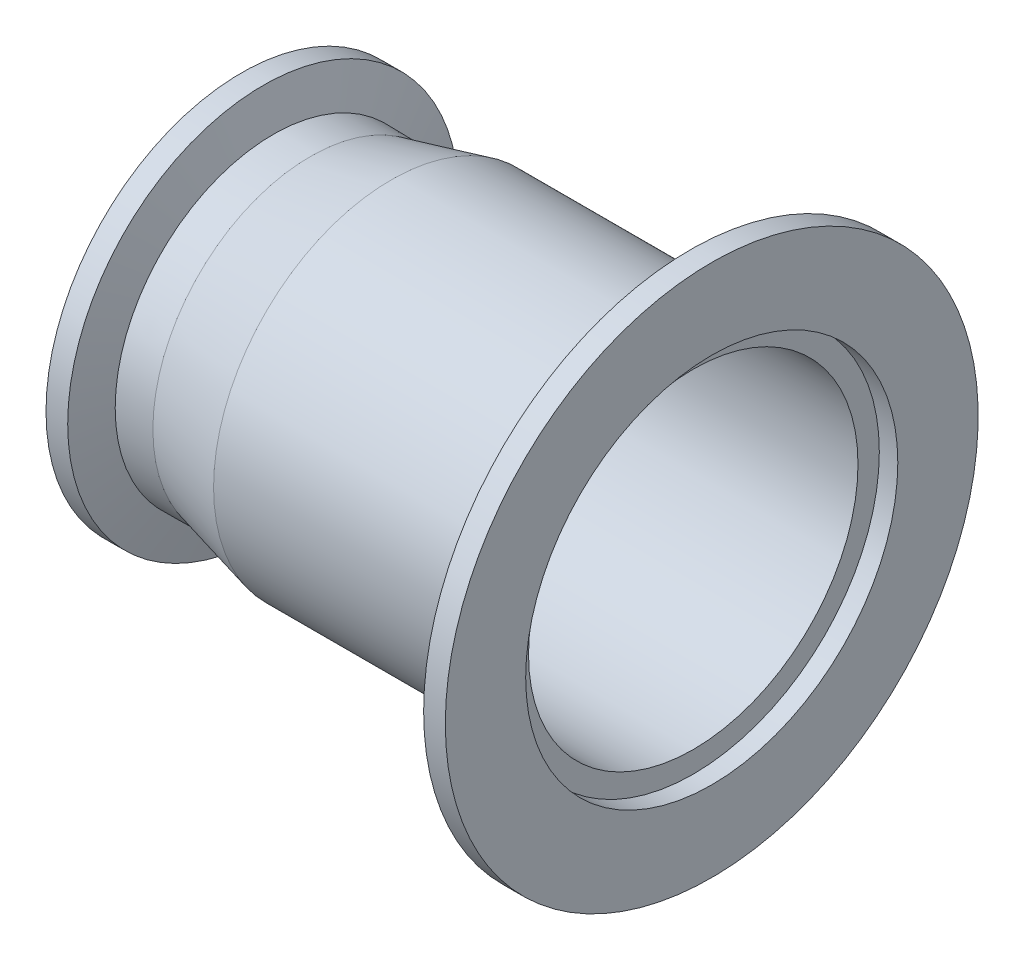
ISO-10303-21;
HEADER;
FILE_DESCRIPTION(('STEP AP214'),'2;1');
FILE_NAME('part.step','',(''),(''),'','','');
FILE_SCHEMA(('AUTOMOTIVE_DESIGN { 1 0 10303 214 1 1 1 1 }'));
ENDSEC;
DATA;
#1=APPLICATION_CONTEXT('core data for automotive mechanical design processes');
#2=APPLICATION_PROTOCOL_DEFINITION('international standard','automotive_design',2000,#1);
#3=PRODUCT_CONTEXT('',#1,'mechanical');
#4=PRODUCT('Part','Part','',(#3));
#5=PRODUCT_RELATED_PRODUCT_CATEGORY('part','',(#4));
#6=PRODUCT_DEFINITION_FORMATION('','',#4);
#7=PRODUCT_DEFINITION_CONTEXT('part definition',#1,'design');
#8=PRODUCT_DEFINITION('design','',#6,#7);
#9=PRODUCT_DEFINITION_SHAPE('','',#8);
#10=(LENGTH_UNIT() NAMED_UNIT(*) SI_UNIT(.MILLI.,.METRE.));
#11=(NAMED_UNIT(*) PLANE_ANGLE_UNIT() SI_UNIT($,.RADIAN.));
#12=(NAMED_UNIT(*) SI_UNIT($,.STERADIAN.) SOLID_ANGLE_UNIT());
#13=UNCERTAINTY_MEASURE_WITH_UNIT(LENGTH_MEASURE(1.E-05),#10,'distance_accuracy_value','');
#14=(GEOMETRIC_REPRESENTATION_CONTEXT(3) GLOBAL_UNCERTAINTY_ASSIGNED_CONTEXT((#13)) GLOBAL_UNIT_ASSIGNED_CONTEXT((#10,
#11,#12)) REPRESENTATION_CONTEXT('',''));
#15=CARTESIAN_POINT('',(0.,0.,0.));
#16=DIRECTION('',(0.,0.,1.));
#17=DIRECTION('',(1.,0.,0.));
#18=AXIS2_PLACEMENT_3D('',#15,#16,#17);
#19=CARTESIAN_POINT('',(66.5851096693486,0.,0.));
#20=DIRECTION('',(1.,0.,0.));
#21=DIRECTION('',(0.,0.,-1.));
#22=AXIS2_PLACEMENT_3D('',#19,#20,#21);
#23=PLANE('',#22);
#24=CARTESIAN_POINT('',(66.5851096693486,0.,14.69801));
#25=DIRECTION('',(-1.,0.,0.));
#26=DIRECTION('',(0.,0.,1.));
#27=AXIS2_PLACEMENT_3D('',#24,#25,#26);
#28=CIRCLE('',#27,23.1649995639334);
#29=CARTESIAN_POINT('',(66.5851096693486,0.,37.8630095639334));
#30=VERTEX_POINT('',#29);
#31=EDGE_CURVE('E84',#30,#30,#28,.T.);
#32=ORIENTED_EDGE('',*,*,#31,.T.);
#33=EDGE_LOOP('',(#32));
#34=FACE_BOUND('',#33,.T.);
#35=CARTESIAN_POINT('',(66.5851096693486,0.,14.69801));
#36=DIRECTION('',(-1.,0.,0.));
#37=DIRECTION('',(0.,0.,1.));
#38=AXIS2_PLACEMENT_3D('',#35,#36,#37);
#39=CIRCLE('',#38,26.1649995639334);
#40=CARTESIAN_POINT('',(66.5851096693486,0.,40.8630095639334));
#41=VERTEX_POINT('',#40);
#42=EDGE_CURVE('E10',#41,#41,#39,.T.);
#43=ORIENTED_EDGE('',*,*,#42,.F.);
#44=EDGE_LOOP('',(#43));
#45=FACE_BOUND('',#44,.T.);
#46=ADVANCED_FACE('F32',(#34,#45),#23,.T.);
#47=CARTESIAN_POINT('',(0.,0.,14.69801));
#48=DIRECTION('',(-1.,0.,0.));
#49=DIRECTION('',(0.,0.,1.));
#50=AXIS2_PLACEMENT_3D('',#47,#48,#49);
#51=CYLINDRICAL_SURFACE('',#50,26.1649995639334);
#52=ORIENTED_EDGE('',*,*,#42,.T.);
#53=EDGE_LOOP('',(#52));
#54=FACE_BOUND('',#53,.T.);
#55=CARTESIAN_POINT('',(69.1851096693486,0.,14.69801));
#56=DIRECTION('',(-1.,0.,0.));
#57=DIRECTION('',(0.,0.,1.));
#58=AXIS2_PLACEMENT_3D('',#55,#56,#57);
#59=CIRCLE('',#58,26.1649995639334);
#60=CARTESIAN_POINT('',(69.1851096693486,0.,40.8630095639334));
#61=VERTEX_POINT('',#60);
#62=EDGE_CURVE('E38',#61,#61,#59,.T.);
#63=ORIENTED_EDGE('',*,*,#62,.F.);
#64=EDGE_LOOP('',(#63));
#65=FACE_BOUND('',#64,.T.);
#66=ADVANCED_FACE('F132',(#54,#65),#51,.F.);
#67=CARTESIAN_POINT('',(69.1851096693485,0.,0.));
#68=DIRECTION('',(1.,0.,0.));
#69=DIRECTION('',(0.,0.,-1.));
#70=AXIS2_PLACEMENT_3D('',#67,#68,#69);
#71=PLANE('',#70);
#72=ORIENTED_EDGE('',*,*,#62,.T.);
#73=EDGE_LOOP('',(#72));
#74=FACE_BOUND('',#73,.T.);
#75=CARTESIAN_POINT('',(69.1851096693485,0.,14.69801));
#76=DIRECTION('',(-1.,0.,0.));
#77=DIRECTION('',(0.,0.,1.));
#78=AXIS2_PLACEMENT_3D('',#75,#76,#77);
#79=CIRCLE('',#78,37.4649995639334);
#80=CARTESIAN_POINT('',(69.1851096693485,0.,52.1630095639334));
#81=VERTEX_POINT('',#80);
#82=EDGE_CURVE('E42',#81,#81,#79,.T.);
#83=ORIENTED_EDGE('',*,*,#82,.F.);
#84=EDGE_LOOP('',(#83));
#85=FACE_BOUND('',#84,.T.);
#86=ADVANCED_FACE('F136',(#74,#85),#71,.T.);
#87=CARTESIAN_POINT('',(0.,0.,14.69801));
#88=DIRECTION('',(-1.,0.,0.));
#89=DIRECTION('',(0.,0.,1.));
#90=AXIS2_PLACEMENT_3D('',#87,#88,#89);
#91=CYLINDRICAL_SURFACE('',#90,37.4649995639334);
#92=ORIENTED_EDGE('',*,*,#82,.T.);
#93=EDGE_LOOP('',(#92));
#94=FACE_BOUND('',#93,.T.);
#95=CARTESIAN_POINT('',(66.1351096716383,0.,14.69801));
#96=DIRECTION('',(-1.,0.,0.));
#97=DIRECTION('',(0.,0.,1.));
#98=AXIS2_PLACEMENT_3D('',#95,#96,#97);
#99=CIRCLE('',#98,37.4649995639334);
#100=CARTESIAN_POINT('',(66.1351096716383,0.,52.1630095639334));
#101=VERTEX_POINT('',#100);
#102=EDGE_CURVE('E46',#101,#101,#99,.T.);
#103=ORIENTED_EDGE('',*,*,#102,.F.);
#104=EDGE_LOOP('',(#103));
#105=FACE_BOUND('',#104,.T.);
#106=ADVANCED_FACE('F140',(#94,#105),#91,.T.);
#107=CARTESIAN_POINT('',(64.1051096716383,0.,14.69801));
#108=DIRECTION('',(1.,0.,0.));
#109=DIRECTION('',(0.,0.,-1.));
#110=AXIS2_PLACEMENT_3D('',#107,#108,#109);
#111=CONICAL_SURFACE('',#110,29.8849995639334,1.30912678720113);
#112=ORIENTED_EDGE('',*,*,#102,.T.);
#113=EDGE_LOOP('',(#112));
#114=FACE_BOUND('',#113,.T.);
#115=CARTESIAN_POINT('',(64.1051096716383,0.,14.69801));
#116=DIRECTION('',(-1.,0.,0.));
#117=DIRECTION('',(0.,0.,1.));
#118=AXIS2_PLACEMENT_3D('',#115,#116,#117);
#119=CIRCLE('',#118,29.8849995639334);
#120=CARTESIAN_POINT('',(64.1051096716383,0.,44.5830095639334));
#121=VERTEX_POINT('',#120);
#122=EDGE_CURVE('E51',#121,#121,#119,.T.);
#123=ORIENTED_EDGE('',*,*,#122,.F.);
#124=EDGE_LOOP('',(#123));
#125=FACE_BOUND('',#124,.T.);
#126=ADVANCED_FACE('F146',(#114,#125),#111,.T.);
#127=CARTESIAN_POINT('',(64.1051096716383,0.,0.));
#128=DIRECTION('',(-1.,0.,0.));
#129=DIRECTION('',(0.,0.,1.));
#130=AXIS2_PLACEMENT_3D('',#127,#128,#129);
#131=PLANE('',#130);
#132=ORIENTED_EDGE('',*,*,#122,.T.);
#133=EDGE_LOOP('',(#132));
#134=FACE_BOUND('',#133,.T.);
#135=CARTESIAN_POINT('',(64.1051096716383,0.,14.69801));
#136=DIRECTION('',(-1.,0.,0.));
#137=DIRECTION('',(0.,0.,1.));
#138=AXIS2_PLACEMENT_3D('',#135,#136,#137);
#139=CIRCLE('',#138,24.9749995639334);
#140=CARTESIAN_POINT('',(64.1051096716383,0.,39.6730095639334));
#141=VERTEX_POINT('',#140);
#142=EDGE_CURVE('E54',#141,#141,#139,.T.);
#143=ORIENTED_EDGE('',*,*,#142,.F.);
#144=EDGE_LOOP('',(#143));
#145=FACE_BOUND('',#144,.T.);
#146=ADVANCED_FACE('F150',(#134,#145),#131,.T.);
#147=CARTESIAN_POINT('',(0.,0.,14.69801));
#148=DIRECTION('',(-1.,0.,0.));
#149=DIRECTION('',(0.,0.,1.));
#150=AXIS2_PLACEMENT_3D('',#147,#148,#149);
#151=CYLINDRICAL_SURFACE('',#150,24.9749995639334);
#152=ORIENTED_EDGE('',*,*,#142,.T.);
#153=EDGE_LOOP('',(#152));
#154=FACE_BOUND('',#153,.T.);
#155=CARTESIAN_POINT('',(24.1051096716383,0.,14.69801));
#156=DIRECTION('',(-1.,0.,0.));
#157=DIRECTION('',(0.,0.,1.));
#158=AXIS2_PLACEMENT_3D('',#155,#156,#157);
#159=CIRCLE('',#158,24.9749995639334);
#160=CARTESIAN_POINT('',(24.1051096716383,0.,39.6730095639334));
#161=VERTEX_POINT('',#160);
#162=EDGE_CURVE('E57',#161,#161,#159,.T.);
#163=ORIENTED_EDGE('',*,*,#162,.F.);
#164=EDGE_LOOP('',(#163));
#165=FACE_BOUND('',#164,.T.);
#166=ADVANCED_FACE('F154',(#154,#165),#151,.T.);
#167=CARTESIAN_POINT('',(12.7623913864332,0.,14.69801));
#168=DIRECTION('',(1.,0.,0.));
#169=DIRECTION('',(0.,0.,-1.));
#170=AXIS2_PLACEMENT_3D('',#167,#168,#169);
#171=CONICAL_SURFACE('',#170,22.1649995639334,0.24284673560279);
#172=ORIENTED_EDGE('',*,*,#162,.T.);
#173=EDGE_LOOP('',(#172));
#174=FACE_BOUND('',#173,.T.);
#175=CARTESIAN_POINT('',(12.7623913864332,0.,14.69801));
#176=DIRECTION('',(-1.,0.,0.));
#177=DIRECTION('',(0.,0.,1.));
#178=AXIS2_PLACEMENT_3D('',#175,#176,#177);
#179=CIRCLE('',#178,22.1649995639334);
#180=CARTESIAN_POINT('',(12.7623913864332,0.,36.8630095639334));
#181=VERTEX_POINT('',#180);
#182=EDGE_CURVE('E60',#181,#181,#179,.T.);
#183=ORIENTED_EDGE('',*,*,#182,.F.);
#184=EDGE_LOOP('',(#183));
#185=FACE_BOUND('',#184,.T.);
#186=ADVANCED_FACE('F158',(#174,#185),#171,.T.);
#187=CARTESIAN_POINT('',(7.52239138643324,0.,14.69801));
#188=DIRECTION('',(-1.,0.,0.));
#189=DIRECTION('',(0.,0.,1.));
#190=AXIS2_PLACEMENT_3D('',#187,#188,#189);
#191=CONICAL_SURFACE('',#190,22.2249995639334,0.0114498812941701);
#192=ORIENTED_EDGE('',*,*,#182,.T.);
#193=EDGE_LOOP('',(#192));
#194=FACE_BOUND('',#193,.T.);
#195=CARTESIAN_POINT('',(7.52239138643324,0.,14.69801));
#196=DIRECTION('',(-1.,0.,0.));
#197=DIRECTION('',(0.,0.,1.));
#198=AXIS2_PLACEMENT_3D('',#195,#196,#197);
#199=CIRCLE('',#198,22.2249995639334);
#200=CARTESIAN_POINT('',(7.52239138643324,0.,36.9230095639334));
#201=VERTEX_POINT('',#200);
#202=EDGE_CURVE('E63',#201,#201,#199,.T.);
#203=ORIENTED_EDGE('',*,*,#202,.F.);
#204=EDGE_LOOP('',(#203));
#205=FACE_BOUND('',#204,.T.);
#206=ADVANCED_FACE('F128',(#194,#205),#191,.T.);
#207=CARTESIAN_POINT('',(6.11239138643324,0.,14.69801));
#208=DIRECTION('',(-1.,0.,0.));
#209=DIRECTION('',(0.,0.,1.));
#210=AXIS2_PLACEMENT_3D('',#207,#208,#209);
#211=CONICAL_SURFACE('',#210,27.4949995639334,1.30936739136992);
#212=ORIENTED_EDGE('',*,*,#202,.T.);
#213=EDGE_LOOP('',(#212));
#214=FACE_BOUND('',#213,.T.);
#215=CARTESIAN_POINT('',(6.11239138643324,0.,14.69801));
#216=DIRECTION('',(-1.,0.,0.));
#217=DIRECTION('',(0.,0.,1.));
#218=AXIS2_PLACEMENT_3D('',#215,#216,#217);
#219=CIRCLE('',#218,27.4949995639334);
#220=CARTESIAN_POINT('',(6.11239138643324,0.,42.1930095639334));
#221=VERTEX_POINT('',#220);
#222=EDGE_CURVE('E66',#221,#221,#219,.T.);
#223=ORIENTED_EDGE('',*,*,#222,.F.);
#224=EDGE_LOOP('',(#223));
#225=FACE_BOUND('',#224,.T.);
#226=ADVANCED_FACE('F122',(#214,#225),#211,.T.);
#227=CARTESIAN_POINT('',(0.,0.,14.69801));
#228=DIRECTION('',(-1.,0.,0.));
#229=DIRECTION('',(0.,0.,1.));
#230=AXIS2_PLACEMENT_3D('',#227,#228,#229);
#231=CYLINDRICAL_SURFACE('',#230,27.4949995639334);
#232=ORIENTED_EDGE('',*,*,#222,.T.);
#233=EDGE_LOOP('',(#232));
#234=FACE_BOUND('',#233,.T.);
#235=CARTESIAN_POINT('',(3.06239138643324,0.,14.69801));
#236=DIRECTION('',(-1.,0.,0.));
#237=DIRECTION('',(0.,0.,1.));
#238=AXIS2_PLACEMENT_3D('',#235,#236,#237);
#239=CIRCLE('',#238,27.4949995639334);
#240=CARTESIAN_POINT('',(3.06239138643324,0.,42.1930095639334));
#241=VERTEX_POINT('',#240);
#242=EDGE_CURVE('E69',#241,#241,#239,.T.);
#243=ORIENTED_EDGE('',*,*,#242,.F.);
#244=EDGE_LOOP('',(#243));
#245=FACE_BOUND('',#244,.T.);
#246=ADVANCED_FACE('F117',(#234,#245),#231,.T.);
#247=CARTESIAN_POINT('',(3.06239138643324,0.,0.));
#248=DIRECTION('',(1.,0.,0.));
#249=DIRECTION('',(0.,0.,-1.));
#250=AXIS2_PLACEMENT_3D('',#247,#248,#249);
#251=PLANE('',#250);
#252=CARTESIAN_POINT('',(3.06239138643324,0.,14.69801));
#253=DIRECTION('',(-1.,0.,0.));
#254=DIRECTION('',(0.,0.,1.));
#255=AXIS2_PLACEMENT_3D('',#252,#253,#254);
#256=CIRCLE('',#255,20.5949995639334);
#257=CARTESIAN_POINT('',(3.06239138643324,0.,35.2930095639334));
#258=VERTEX_POINT('',#257);
#259=EDGE_CURVE('E72',#258,#258,#256,.T.);
#260=ORIENTED_EDGE('',*,*,#259,.F.);
#261=EDGE_LOOP('',(#260));
#262=FACE_BOUND('',#261,.T.);
#263=ORIENTED_EDGE('',*,*,#242,.T.);
#264=EDGE_LOOP('',(#263));
#265=FACE_BOUND('',#264,.T.);
#266=ADVANCED_FACE('F111',(#262,#265),#251,.F.);
#267=CARTESIAN_POINT('',(0.,0.,14.69801));
#268=DIRECTION('',(-1.,0.,0.));
#269=DIRECTION('',(0.,0.,1.));
#270=AXIS2_PLACEMENT_3D('',#267,#268,#269);
#271=CYLINDRICAL_SURFACE('',#270,20.5949995639334);
#272=CARTESIAN_POINT('',(5.66239138643324,0.,14.69801));
#273=DIRECTION('',(-1.,0.,0.));
#274=DIRECTION('',(0.,0.,1.));
#275=AXIS2_PLACEMENT_3D('',#272,#273,#274);
#276=CIRCLE('',#275,20.5949995639334);
#277=CARTESIAN_POINT('',(5.66239138643324,0.,35.2930095639334));
#278=VERTEX_POINT('',#277);
#279=EDGE_CURVE('E75',#278,#278,#276,.T.);
#280=ORIENTED_EDGE('',*,*,#279,.F.);
#281=EDGE_LOOP('',(#280));
#282=FACE_BOUND('',#281,.T.);
#283=ORIENTED_EDGE('',*,*,#259,.T.);
#284=EDGE_LOOP('',(#283));
#285=FACE_BOUND('',#284,.T.);
#286=ADVANCED_FACE('F105',(#282,#285),#271,.F.);
#287=CARTESIAN_POINT('',(5.66239138643324,0.,0.));
#288=DIRECTION('',(1.,0.,0.));
#289=DIRECTION('',(0.,0.,-1.));
#290=AXIS2_PLACEMENT_3D('',#287,#288,#289);
#291=PLANE('',#290);
#292=CARTESIAN_POINT('',(5.66239138643324,0.,14.69801));
#293=DIRECTION('',(-1.,0.,0.));
#294=DIRECTION('',(0.,0.,1.));
#295=AXIS2_PLACEMENT_3D('',#292,#293,#294);
#296=CIRCLE('',#295,17.5949995639334);
#297=CARTESIAN_POINT('',(5.66239138643324,0.,32.2930095639334));
#298=VERTEX_POINT('',#297);
#299=EDGE_CURVE('E78',#298,#298,#296,.T.);
#300=ORIENTED_EDGE('',*,*,#299,.F.);
#301=EDGE_LOOP('',(#300));
#302=FACE_BOUND('',#301,.T.);
#303=ORIENTED_EDGE('',*,*,#279,.T.);
#304=EDGE_LOOP('',(#303));
#305=FACE_BOUND('',#304,.T.);
#306=ADVANCED_FACE('F99',(#302,#305),#291,.F.);
#307=CARTESIAN_POINT('',(5.66239138643324,0.,14.69801));
#308=DIRECTION('',(1.,0.,0.));
#309=DIRECTION('',(0.,0.,-1.));
#310=AXIS2_PLACEMENT_3D('',#307,#308,#309);
#311=CONICAL_SURFACE('',#310,17.5949995639334,0.24284673560279);
#312=CARTESIAN_POINT('',(28.1460002293486,0.,14.69801));
#313=DIRECTION('',(-1.,0.,0.));
#314=DIRECTION('',(0.,0.,1.));
#315=AXIS2_PLACEMENT_3D('',#312,#313,#314);
#316=CIRCLE('',#315,23.1649995639334);
#317=CARTESIAN_POINT('',(28.1460002293486,0.,37.8630095639334));
#318=VERTEX_POINT('',#317);
#319=EDGE_CURVE('E81',#318,#318,#316,.T.);
#320=ORIENTED_EDGE('',*,*,#319,.F.);
#321=EDGE_LOOP('',(#320));
#322=FACE_BOUND('',#321,.T.);
#323=ORIENTED_EDGE('',*,*,#299,.T.);
#324=EDGE_LOOP('',(#323));
#325=FACE_BOUND('',#324,.T.);
#326=ADVANCED_FACE('F93',(#322,#325),#311,.F.);
#327=CARTESIAN_POINT('',(0.,0.,14.69801));
#328=DIRECTION('',(-1.,0.,0.));
#329=DIRECTION('',(0.,0.,1.));
#330=AXIS2_PLACEMENT_3D('',#327,#328,#329);
#331=CYLINDRICAL_SURFACE('',#330,23.1649995639334);
#332=ORIENTED_EDGE('',*,*,#31,.F.);
#333=EDGE_LOOP('',(#332));
#334=FACE_BOUND('',#333,.T.);
#335=ORIENTED_EDGE('',*,*,#319,.T.);
#336=EDGE_LOOP('',(#335));
#337=FACE_BOUND('',#336,.T.);
#338=ADVANCED_FACE('F90',(#334,#337),#331,.F.);
#339=CLOSED_SHELL('',(#46,#66,#86,#106,#126,#146,#166,#186,#206,#226,#246,#266,#286,#306,#326,#338));
#340=MANIFOLD_SOLID_BREP('B2',#339);
#341=ADVANCED_BREP_SHAPE_REPRESENTATION('',(#18,#340),#14);
#342=SHAPE_DEFINITION_REPRESENTATION(#9,#341);
ENDSEC;
END-ISO-10303-21;
